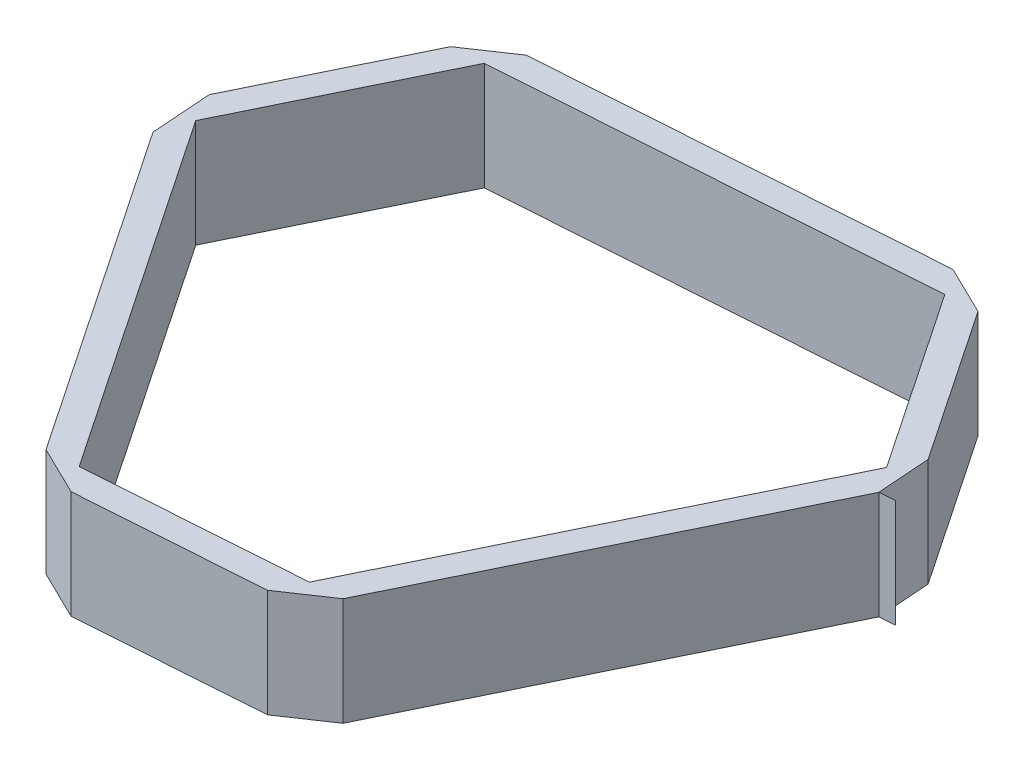
ISO-10303-21;
HEADER;
FILE_DESCRIPTION(('STEP AP214'),'2;1');
FILE_NAME('part.step','',(''),(''),'','','');
FILE_SCHEMA(('AUTOMOTIVE_DESIGN { 1 0 10303 214 1 1 1 1 }'));
ENDSEC;
DATA;
#1=APPLICATION_CONTEXT('core data for automotive mechanical design processes');
#2=APPLICATION_PROTOCOL_DEFINITION('international standard','automotive_design',2000,#1);
#3=PRODUCT_CONTEXT('',#1,'mechanical');
#4=PRODUCT('Part','Part','',(#3));
#5=PRODUCT_RELATED_PRODUCT_CATEGORY('part','',(#4));
#6=PRODUCT_DEFINITION_FORMATION('','',#4);
#7=PRODUCT_DEFINITION_CONTEXT('part definition',#1,'design');
#8=PRODUCT_DEFINITION('design','',#6,#7);
#9=PRODUCT_DEFINITION_SHAPE('','',#8);
#10=(LENGTH_UNIT() NAMED_UNIT(*) SI_UNIT(.MILLI.,.METRE.));
#11=(NAMED_UNIT(*) PLANE_ANGLE_UNIT() SI_UNIT($,.RADIAN.));
#12=(NAMED_UNIT(*) SI_UNIT($,.STERADIAN.) SOLID_ANGLE_UNIT());
#13=UNCERTAINTY_MEASURE_WITH_UNIT(LENGTH_MEASURE(1.E-05),#10,'distance_accuracy_value','');
#14=(GEOMETRIC_REPRESENTATION_CONTEXT(3) GLOBAL_UNCERTAINTY_ASSIGNED_CONTEXT((#13)) GLOBAL_UNIT_ASSIGNED_CONTEXT((#10,
#11,#12)) REPRESENTATION_CONTEXT('',''));
#15=CARTESIAN_POINT('',(0.,0.,0.));
#16=DIRECTION('',(0.,0.,1.));
#17=DIRECTION('',(1.,0.,0.));
#18=AXIS2_PLACEMENT_3D('',#15,#16,#17);
#19=CARTESIAN_POINT('',(0.,25.4,0.));
#20=DIRECTION('',(0.,1.,0.));
#21=DIRECTION('',(0.,0.,1.));
#22=AXIS2_PLACEMENT_3D('',#19,#20,#21);
#23=PLANE('',#22);
#24=DIRECTION('',(0.898726484276233,0.,0.438509642380281));
#25=VECTOR('',#24,1.);
#26=CARTESIAN_POINT('',(102.581317269426,25.4,-95.3013568397199));
#27=LINE('',#26,#25);
#28=CARTESIAN_POINT('',(91.0634324059276,25.4,-100.921201876931));
#29=VERTEX_POINT('',#28);
#30=CARTESIAN_POINT('',(102.581317269426,25.4,-95.3013568397199));
#31=VERTEX_POINT('',#30);
#32=EDGE_CURVE('E309',#29,#31,#27,.T.);
#33=ORIENTED_EDGE('',*,*,#32,.F.);
#34=DIRECTION('',(-0.997574787627234,0.,0.0696027520323615));
#35=VECTOR('',#34,1.);
#36=CARTESIAN_POINT('',(-10.2234799793334,25.4,-93.8542150862529));
#37=LINE('',#36,#35);
#38=CARTESIAN_POINT('',(-2.84222802506587,25.4,-94.3692195308653));
#39=VERTEX_POINT('',#38);
#40=EDGE_CURVE('E225',#29,#39,#37,.T.);
#41=ORIENTED_EDGE('',*,*,#40,.T.);
#42=DIRECTION('',(0.829123732243865,0.,-0.559065145246959));
#43=VECTOR('',#42,1.);
#44=CARTESIAN_POINT('',(-2.84222802506587,25.4,-94.3692195308653));
#45=LINE('',#44,#43);
#46=CARTESIAN_POINT('',(-13.4680990243711,25.4,-87.2043611598173));
#47=VERTEX_POINT('',#46);
#48=EDGE_CURVE('E64',#47,#39,#45,.T.);
#49=ORIENTED_EDGE('',*,*,#48,.F.);
#50=DIRECTION('',(-0.438509642380281,0.,0.898726484276233));
#51=VECTOR('',#50,1.);
#52=CARTESIAN_POINT('',(-35.7150752951471,25.4,-41.6091339691862));
#53=LINE('',#52,#51);
#54=CARTESIAN_POINT('',(-32.0892378011424,25.4,-49.0402959519775));
#55=VERTEX_POINT('',#54);
#56=EDGE_CURVE('E223',#47,#55,#53,.T.);
#57=ORIENTED_EDGE('',*,*,#56,.T.);
#58=DIRECTION('',(0.0696027520323643,0.,0.997574787627234));
#59=VECTOR('',#58,1.);
#60=CARTESIAN_POINT('',(-28.5287186204652,25.4,1.99050472462755));
#61=LINE('',#60,#59);
#62=CARTESIAN_POINT('',(-31.092418985415,25.4,-34.7534855979885));
#63=VERTEX_POINT('',#62);
#64=EDGE_CURVE('E293',#55,#63,#61,.T.);
#65=ORIENTED_EDGE('',*,*,#64,.T.);
#66=DIRECTION('',(0.559065145246955,0.,0.829123732243868));
#67=VECTOR('',#66,1.);
#68=CARTESIAN_POINT('',(25.1852038956499,25.4,48.7092613138225));
#69=LINE('',#68,#67);
#70=CARTESIAN_POINT('',(21.0485709864198,25.4,42.5744118319993));
#71=VERTEX_POINT('',#70);
#72=EDGE_CURVE('E221',#63,#71,#69,.T.);
#73=ORIENTED_EDGE('',*,*,#72,.T.);
#74=DIRECTION('',(-0.898726484276233,0.,-0.438509642380281));
#75=VECTOR('',#74,1.);
#76=CARTESIAN_POINT('',(32.5664558499177,25.4,48.1942568692102));
#77=LINE('',#76,#75);
#78=CARTESIAN_POINT('',(32.5664558499177,25.4,48.1942568692102));
#79=VERTEX_POINT('',#78);
#80=EDGE_CURVE('E179',#79,#71,#77,.T.);
#81=ORIENTED_EDGE('',*,*,#80,.F.);
#82=DIRECTION('',(0.997574787627234,0.,-0.0696027520323612));
#83=VECTOR('',#82,1.);
#84=CARTESIAN_POINT('',(83.1765690237152,25.4,44.6630898817764));
#85=LINE('',#84,#83);
#86=CARTESIAN_POINT('',(75.7953170694474,25.4,45.1780943263887));
#87=VERTEX_POINT('',#86);
#88=EDGE_CURVE('E217',#79,#87,#85,.T.);
#89=ORIENTED_EDGE('',*,*,#88,.T.);
#90=DIRECTION('',(-0.829123732243869,0.,0.559065145246953));
#91=VECTOR('',#90,1.);
#92=CARTESIAN_POINT('',(75.7953170694474,25.4,45.1780943263888));
#93=LINE('',#92,#91);
#94=CARTESIAN_POINT('',(86.4211880687529,25.4,38.0132359553407));
#95=VERTEX_POINT('',#94);
#96=EDGE_CURVE('E302',#95,#87,#93,.T.);
#97=ORIENTED_EDGE('',*,*,#96,.F.);
#98=DIRECTION('',(0.43850964238028,0.,-0.898726484276233));
#99=VECTOR('',#98,1.);
#100=CARTESIAN_POINT('',(83.1765690237152,25.4,44.6630898817764));
#101=LINE('',#100,#99);
#102=CARTESIAN_POINT('',(127.78747707898,25.4,-46.7670650841414));
#103=VERTEX_POINT('',#102);
#104=EDGE_CURVE('E220',#95,#103,#101,.T.);
#105=ORIENTED_EDGE('',*,*,#104,.T.);
#106=DIRECTION('',(0.0710028791074202,0.,0.997476110570302));
#107=VECTOR('',#106,1.);
#108=CARTESIAN_POINT('',(126.899940215872,25.4,-59.2355287482866));
#109=LINE('',#108,#107);
#110=CARTESIAN_POINT('',(126.899940215872,25.4,-59.2355287482866));
#111=VERTEX_POINT('',#110);
#112=EDGE_CURVE('E12',#111,#103,#109,.T.);
#113=ORIENTED_EDGE('',*,*,#112,.F.);
#114=DIRECTION('',(-0.559065145246958,0.,-0.829123732243866));
#115=VECTOR('',#114,1.);
#116=CARTESIAN_POINT('',(130.944454172447,25.4,-53.2372966365231));
#117=LINE('',#116,#115);
#118=EDGE_CURVE('E228',#111,#31,#117,.T.);
#119=ORIENTED_EDGE('',*,*,#118,.T.);
#120=EDGE_LOOP('',(#33,#41,#49,#57,#65,#73,#81,#89,#97,#105,#113,#119));
#121=FACE_BOUND('',#120,.T.);
#122=DIRECTION('',(-0.559065145246958,0.,-0.829123732243866));
#123=VECTOR('',#122,1.);
#124=CARTESIAN_POINT('',(123.629888255845,25.4,-52.7269450077209));
#125=LINE('',#124,#123);
#126=CARTESIAN_POINT('',(123.629888255845,25.4,-52.7269450077209));
#127=VERTEX_POINT('',#126);
#128=CARTESIAN_POINT('',(95.2293788773,25.4,-94.846430605709));
#129=VERTEX_POINT('',#128);
#130=EDGE_CURVE('E246',#127,#129,#125,.T.);
#131=ORIENTED_EDGE('',*,*,#130,.F.);
#132=DIRECTION('',(0.43850964238028,0.,-0.898726484276233));
#133=VECTOR('',#132,1.);
#134=CARTESIAN_POINT('',(79.0773085900088,25.4,38.5836657947445));
#135=LINE('',#134,#133);
#136=CARTESIAN_POINT('',(79.0773085900088,25.4,38.5836657947445));
#137=VERTEX_POINT('',#136);
#138=EDGE_CURVE('E243',#137,#127,#135,.T.);
#139=ORIENTED_EDGE('',*,*,#138,.F.);
#140=DIRECTION('',(0.997574787627234,0.,-0.0696027520323612));
#141=VECTOR('',#140,1.);
#142=CARTESIAN_POINT('',(79.0773085900088,25.4,38.5836657947445));
#143=LINE('',#142,#141);
#144=CARTESIAN_POINT('',(28.4005093785453,25.4,42.1194855979885));
#145=VERTEX_POINT('',#144);
#146=EDGE_CURVE('E240',#145,#137,#143,.T.);
#147=ORIENTED_EDGE('',*,*,#146,.F.);
#148=DIRECTION('',(0.559065145246955,0.,0.829123732243868));
#149=VECTOR('',#148,1.);
#150=CARTESIAN_POINT('',(28.4005093785453,25.4,42.1194855979885));
#151=LINE('',#150,#149);
#152=CARTESIAN_POINT('',(-28.4005093785453,25.4,-42.1194855979885));
#153=VERTEX_POINT('',#152);
#154=EDGE_CURVE('E237',#153,#145,#151,.T.);
#155=ORIENTED_EDGE('',*,*,#154,.F.);
#156=DIRECTION('',(-0.438509642380281,0.,0.898726484276233));
#157=VECTOR('',#156,1.);
#158=CARTESIAN_POINT('',(-28.4005093785453,25.4,-42.1194855979885));
#159=LINE('',#158,#157);
#160=CARTESIAN_POINT('',(-6.12421954562703,25.4,-87.7747909992211));
#161=VERTEX_POINT('',#160);
#162=EDGE_CURVE('E202',#161,#153,#159,.T.);
#163=ORIENTED_EDGE('',*,*,#162,.F.);
#164=DIRECTION('',(-0.997574787627234,0.,0.0696027520323615));
#165=VECTOR('',#164,1.);
#166=CARTESIAN_POINT('',(-6.12421954562703,25.4,-87.7747909992211));
#167=LINE('',#166,#165);
#168=EDGE_CURVE('E249',#129,#161,#167,.T.);
#169=ORIENTED_EDGE('',*,*,#168,.F.);
#170=EDGE_LOOP('',(#131,#139,#147,#155,#163,#169));
#171=FACE_BOUND('',#170,.T.);
#172=ADVANCED_FACE('F49',(#121,#171),#23,.T.);
#173=CARTESIAN_POINT('',(0.,0.,0.));
#174=DIRECTION('',(0.,1.,0.));
#175=DIRECTION('',(0.,0.,1.));
#176=AXIS2_PLACEMENT_3D('',#173,#174,#175);
#177=PLANE('',#176);
#178=DIRECTION('',(0.43850964238028,0.,-0.898726484276233));
#179=VECTOR('',#178,1.);
#180=CARTESIAN_POINT('',(79.0773085900088,0.,38.5836657947445));
#181=LINE('',#180,#179);
#182=CARTESIAN_POINT('',(79.0773085900088,0.,38.5836657947445));
#183=VERTEX_POINT('',#182);
#184=CARTESIAN_POINT('',(123.629888255845,0.,-52.7269450077209));
#185=VERTEX_POINT('',#184);
#186=EDGE_CURVE('E233',#183,#185,#181,.T.);
#187=ORIENTED_EDGE('',*,*,#186,.T.);
#188=DIRECTION('',(-0.559065145246958,0.,-0.829123732243866));
#189=VECTOR('',#188,1.);
#190=CARTESIAN_POINT('',(123.629888255845,0.,-52.7269450077209));
#191=LINE('',#190,#189);
#192=CARTESIAN_POINT('',(95.2293788773,0.,-94.846430605709));
#193=VERTEX_POINT('',#192);
#194=EDGE_CURVE('E257',#185,#193,#191,.T.);
#195=ORIENTED_EDGE('',*,*,#194,.T.);
#196=DIRECTION('',(-0.997574787627234,0.,0.0696027520323615));
#197=VECTOR('',#196,1.);
#198=CARTESIAN_POINT('',(-6.12421954562703,0.,-87.7747909992211));
#199=LINE('',#198,#197);
#200=CARTESIAN_POINT('',(-6.12421954562703,0.,-87.7747909992211));
#201=VERTEX_POINT('',#200);
#202=EDGE_CURVE('E253',#193,#201,#199,.T.);
#203=ORIENTED_EDGE('',*,*,#202,.T.);
#204=DIRECTION('',(-0.438509642380281,0.,0.898726484276233));
#205=VECTOR('',#204,1.);
#206=CARTESIAN_POINT('',(-28.4005093785453,0.,-42.1194855979885));
#207=LINE('',#206,#205);
#208=CARTESIAN_POINT('',(-28.4005093785453,0.,-42.1194855979885));
#209=VERTEX_POINT('',#208);
#210=EDGE_CURVE('E256',#201,#209,#207,.T.);
#211=ORIENTED_EDGE('',*,*,#210,.T.);
#212=DIRECTION('',(0.559065145246955,0.,0.829123732243868));
#213=VECTOR('',#212,1.);
#214=CARTESIAN_POINT('',(28.4005093785453,0.,42.1194855979885));
#215=LINE('',#214,#213);
#216=CARTESIAN_POINT('',(28.4005093785453,0.,42.1194855979885));
#217=VERTEX_POINT('',#216);
#218=EDGE_CURVE('E264',#209,#217,#215,.T.);
#219=ORIENTED_EDGE('',*,*,#218,.T.);
#220=DIRECTION('',(0.997574787627234,0.,-0.0696027520323612));
#221=VECTOR('',#220,1.);
#222=CARTESIAN_POINT('',(79.0773085900088,0.,38.5836657947445));
#223=LINE('',#222,#221);
#224=EDGE_CURVE('E216',#217,#183,#223,.T.);
#225=ORIENTED_EDGE('',*,*,#224,.T.);
#226=EDGE_LOOP('',(#187,#195,#203,#211,#219,#225));
#227=FACE_BOUND('',#226,.T.);
#228=DIRECTION('',(-0.997574787627234,0.,0.0696027520323615));
#229=VECTOR('',#228,1.);
#230=CARTESIAN_POINT('',(-10.2234799793334,0.,-93.8542150862529));
#231=LINE('',#230,#229);
#232=CARTESIAN_POINT('',(91.0634324059276,0.,-100.921201876931));
#233=VERTEX_POINT('',#232);
#234=CARTESIAN_POINT('',(-2.84222802506587,0.,-94.3692195308653));
#235=VERTEX_POINT('',#234);
#236=EDGE_CURVE('E204',#233,#235,#231,.T.);
#237=ORIENTED_EDGE('',*,*,#236,.F.);
#238=DIRECTION('',(-0.898726484276233,0.,-0.438509642380281));
#239=VECTOR('',#238,1.);
#240=CARTESIAN_POINT('',(102.581317269426,0.,-95.3013568397199));
#241=LINE('',#240,#239);
#242=CARTESIAN_POINT('',(102.581317269426,0.,-95.3013568397199));
#243=VERTEX_POINT('',#242);
#244=EDGE_CURVE('E72',#243,#233,#241,.T.);
#245=ORIENTED_EDGE('',*,*,#244,.F.);
#246=DIRECTION('',(-0.559065145246958,0.,-0.829123732243866));
#247=VECTOR('',#246,1.);
#248=CARTESIAN_POINT('',(130.944454172447,0.,-53.2372966365231));
#249=LINE('',#248,#247);
#250=CARTESIAN_POINT('',(126.899940215872,0.,-59.2355287482866));
#251=VERTEX_POINT('',#250);
#252=EDGE_CURVE('E210',#251,#243,#249,.T.);
#253=ORIENTED_EDGE('',*,*,#252,.F.);
#254=DIRECTION('',(-0.0710028791074202,0.,-0.997476110570302));
#255=VECTOR('',#254,1.);
#256=CARTESIAN_POINT('',(126.899940215872,0.,-59.2355287482866));
#257=LINE('',#256,#255);
#258=CARTESIAN_POINT('',(127.78747707898,0.,-46.7670650841414));
#259=VERTEX_POINT('',#258);
#260=EDGE_CURVE('E57',#259,#251,#257,.T.);
#261=ORIENTED_EDGE('',*,*,#260,.F.);
#262=DIRECTION('',(0.43850964238028,0.,-0.898726484276233));
#263=VECTOR('',#262,1.);
#264=CARTESIAN_POINT('',(83.1765690237152,0.,44.6630898817764));
#265=LINE('',#264,#263);
#266=CARTESIAN_POINT('',(86.4211880687529,0.,38.0132359553407));
#267=VERTEX_POINT('',#266);
#268=EDGE_CURVE('E214',#267,#259,#265,.T.);
#269=ORIENTED_EDGE('',*,*,#268,.F.);
#270=DIRECTION('',(0.829123732243869,0.,-0.559065145246953));
#271=VECTOR('',#270,1.);
#272=CARTESIAN_POINT('',(75.7953170694474,0.,45.1780943263888));
#273=LINE('',#272,#271);
#274=CARTESIAN_POINT('',(75.7953170694474,0.,45.1780943263888));
#275=VERTEX_POINT('',#274);
#276=EDGE_CURVE('E297',#275,#267,#273,.T.);
#277=ORIENTED_EDGE('',*,*,#276,.F.);
#278=DIRECTION('',(0.997574787627234,0.,-0.0696027520323612));
#279=VECTOR('',#278,1.);
#280=CARTESIAN_POINT('',(83.1765690237152,0.,44.6630898817764));
#281=LINE('',#280,#279);
#282=CARTESIAN_POINT('',(32.5664558499177,0.,48.1942568692102));
#283=VERTEX_POINT('',#282);
#284=EDGE_CURVE('E195',#283,#275,#281,.T.);
#285=ORIENTED_EDGE('',*,*,#284,.F.);
#286=DIRECTION('',(0.898726484276233,0.,0.438509642380281));
#287=VECTOR('',#286,1.);
#288=CARTESIAN_POINT('',(32.5664558499177,0.,48.1942568692102));
#289=LINE('',#288,#287);
#290=CARTESIAN_POINT('',(21.0485709864198,0.,42.5744118319993));
#291=VERTEX_POINT('',#290);
#292=EDGE_CURVE('E176',#291,#283,#289,.T.);
#293=ORIENTED_EDGE('',*,*,#292,.F.);
#294=DIRECTION('',(0.559065145246955,0.,0.829123732243868));
#295=VECTOR('',#294,1.);
#296=CARTESIAN_POINT('',(25.1852038956499,0.,48.7092613138225));
#297=LINE('',#296,#295);
#298=CARTESIAN_POINT('',(-31.092418985415,0.,-34.7534855979885));
#299=VERTEX_POINT('',#298);
#300=EDGE_CURVE('E192',#299,#291,#297,.T.);
#301=ORIENTED_EDGE('',*,*,#300,.F.);
#302=DIRECTION('',(-0.0696027520323643,0.,-0.997574787627234));
#303=VECTOR('',#302,1.);
#304=CARTESIAN_POINT('',(-28.5287186204652,0.,1.99050472462755));
#305=LINE('',#304,#303);
#306=CARTESIAN_POINT('',(-32.0892378011424,0.,-49.0402959519775));
#307=VERTEX_POINT('',#306);
#308=EDGE_CURVE('E231',#299,#307,#305,.T.);
#309=ORIENTED_EDGE('',*,*,#308,.T.);
#310=DIRECTION('',(-0.438509642380281,0.,0.898726484276233));
#311=VECTOR('',#310,1.);
#312=CARTESIAN_POINT('',(-35.7150752951471,0.,-41.6091339691862));
#313=LINE('',#312,#311);
#314=CARTESIAN_POINT('',(-13.4680990243711,0.,-87.2043611598173));
#315=VERTEX_POINT('',#314);
#316=EDGE_CURVE('E200',#315,#307,#313,.T.);
#317=ORIENTED_EDGE('',*,*,#316,.F.);
#318=DIRECTION('',(-0.829123732243865,0.,0.559065145246959));
#319=VECTOR('',#318,1.);
#320=CARTESIAN_POINT('',(-2.84222802506587,0.,-94.3692195308653));
#321=LINE('',#320,#319);
#322=EDGE_CURVE('E311',#235,#315,#321,.T.);
#323=ORIENTED_EDGE('',*,*,#322,.F.);
#324=EDGE_LOOP('',(#237,#245,#253,#261,#269,#277,#285,#293,#301,#309,#317,#323));
#325=FACE_BOUND('',#324,.T.);
#326=ADVANCED_FACE('F190',(#227,#325),#177,.F.);
#327=CARTESIAN_POINT('',(-35.7150752951471,25.4,-41.6091339691862));
#328=DIRECTION('',(0.898726484276233,0.,0.438509642380281));
#329=DIRECTION('',(0.438509642380281,0.,-0.898726484276233));
#330=AXIS2_PLACEMENT_3D('',#327,#328,#329);
#331=PLANE('',#330);
#332=ORIENTED_EDGE('',*,*,#56,.F.);
#333=DIRECTION('',(0.,1.,0.));
#334=VECTOR('',#333,1.);
#335=CARTESIAN_POINT('',(-13.4680990243711,-13.0498294967183,-87.2043611598173));
#336=LINE('',#335,#334);
#337=EDGE_CURVE('E316',#315,#47,#336,.T.);
#338=ORIENTED_EDGE('',*,*,#337,.F.);
#339=ORIENTED_EDGE('',*,*,#316,.T.);
#340=DIRECTION('',(0.,1.,0.));
#341=VECTOR('',#340,1.);
#342=CARTESIAN_POINT('',(-32.0892378011424,-15.0160547897493,-49.0402959519775));
#343=LINE('',#342,#341);
#344=EDGE_CURVE('E290',#307,#55,#343,.T.);
#345=ORIENTED_EDGE('',*,*,#344,.T.);
#346=EDGE_LOOP('',(#332,#338,#339,#345));
#347=FACE_BOUND('',#346,.T.);
#348=ADVANCED_FACE('F345',(#347),#331,.F.);
#349=CARTESIAN_POINT('',(25.1852038956499,25.4,48.7092613138225));
#350=DIRECTION('',(0.829123732243868,0.,-0.559065145246955));
#351=DIRECTION('',(-0.559065145246955,0.,-0.829123732243868));
#352=AXIS2_PLACEMENT_3D('',#349,#350,#351);
#353=PLANE('',#352);
#354=ORIENTED_EDGE('',*,*,#300,.T.);
#355=DIRECTION('',(0.,1.,0.));
#356=VECTOR('',#355,1.);
#357=CARTESIAN_POINT('',(21.0485709864198,-13.0498294967183,42.5744118319993));
#358=LINE('',#357,#356);
#359=EDGE_CURVE('E173',#291,#71,#358,.T.);
#360=ORIENTED_EDGE('',*,*,#359,.T.);
#361=ORIENTED_EDGE('',*,*,#72,.F.);
#362=DIRECTION('',(0.,1.,0.));
#363=VECTOR('',#362,1.);
#364=CARTESIAN_POINT('',(-31.092418985415,-15.0160547897493,-34.7534855979885));
#365=LINE('',#364,#363);
#366=EDGE_CURVE('E199',#299,#63,#365,.T.);
#367=ORIENTED_EDGE('',*,*,#366,.F.);
#368=EDGE_LOOP('',(#354,#360,#361,#367));
#369=FACE_BOUND('',#368,.T.);
#370=ADVANCED_FACE('F198',(#369),#353,.F.);
#371=CARTESIAN_POINT('',(83.1765690237152,25.4,44.6630898817764));
#372=DIRECTION('',(-0.898726484276233,0.,-0.43850964238028));
#373=DIRECTION('',(-0.43850964238028,0.,0.898726484276233));
#374=AXIS2_PLACEMENT_3D('',#371,#372,#373);
#375=PLANE('',#374);
#376=ORIENTED_EDGE('',*,*,#104,.F.);
#377=DIRECTION('',(0.,1.,0.));
#378=VECTOR('',#377,1.);
#379=CARTESIAN_POINT('',(86.4211880687529,-13.0498294967183,38.0132359553407));
#380=LINE('',#379,#378);
#381=EDGE_CURVE('E299',#267,#95,#380,.T.);
#382=ORIENTED_EDGE('',*,*,#381,.F.);
#383=ORIENTED_EDGE('',*,*,#268,.T.);
#384=DIRECTION('',(0.,1.,0.));
#385=VECTOR('',#384,1.);
#386=CARTESIAN_POINT('',(127.78747707898,25.4,-46.7670650841414));
#387=LINE('',#386,#385);
#388=EDGE_CURVE('E52',#259,#103,#387,.T.);
#389=ORIENTED_EDGE('',*,*,#388,.T.);
#390=EDGE_LOOP('',(#376,#382,#383,#389));
#391=FACE_BOUND('',#390,.T.);
#392=ADVANCED_FACE('F334',(#391),#375,.F.);
#393=CARTESIAN_POINT('',(130.944454172447,25.4,-53.2372966365231));
#394=DIRECTION('',(-0.829123732243866,0.,0.559065145246958));
#395=DIRECTION('',(0.559065145246958,0.,0.829123732243866));
#396=AXIS2_PLACEMENT_3D('',#393,#394,#395);
#397=PLANE('',#396);
#398=ORIENTED_EDGE('',*,*,#252,.T.);
#399=DIRECTION('',(0.,1.,0.));
#400=VECTOR('',#399,1.);
#401=CARTESIAN_POINT('',(102.581317269426,-13.0498294967183,-95.3013568397199));
#402=LINE('',#401,#400);
#403=EDGE_CURVE('E312',#243,#31,#402,.T.);
#404=ORIENTED_EDGE('',*,*,#403,.T.);
#405=ORIENTED_EDGE('',*,*,#118,.F.);
#406=DIRECTION('',(0.,-1.,0.));
#407=VECTOR('',#406,1.);
#408=CARTESIAN_POINT('',(126.899940215872,25.4,-59.2355287482866));
#409=LINE('',#408,#407);
#410=EDGE_CURVE('E213',#111,#251,#409,.T.);
#411=ORIENTED_EDGE('',*,*,#410,.T.);
#412=EDGE_LOOP('',(#398,#404,#405,#411));
#413=FACE_BOUND('',#412,.T.);
#414=ADVANCED_FACE('F288',(#413),#397,.F.);
#415=CARTESIAN_POINT('',(-10.2234799793334,25.4,-93.8542150862529));
#416=DIRECTION('',(0.0696027520323615,0.,0.997574787627234));
#417=DIRECTION('',(0.997574787627234,0.,-0.0696027520323615));
#418=AXIS2_PLACEMENT_3D('',#415,#416,#417);
#419=PLANE('',#418);
#420=ORIENTED_EDGE('',*,*,#40,.F.);
#421=DIRECTION('',(0.,1.,0.));
#422=VECTOR('',#421,1.);
#423=CARTESIAN_POINT('',(91.0634324059276,-13.0498294967183,-100.921201876931));
#424=LINE('',#423,#422);
#425=EDGE_CURVE('E308',#233,#29,#424,.T.);
#426=ORIENTED_EDGE('',*,*,#425,.F.);
#427=ORIENTED_EDGE('',*,*,#236,.T.);
#428=DIRECTION('',(0.,1.,0.));
#429=VECTOR('',#428,1.);
#430=CARTESIAN_POINT('',(-2.84222802506587,-13.0498294967183,-94.3692195308653));
#431=LINE('',#430,#429);
#432=EDGE_CURVE('E317',#235,#39,#431,.T.);
#433=ORIENTED_EDGE('',*,*,#432,.T.);
#434=EDGE_LOOP('',(#420,#426,#427,#433));
#435=FACE_BOUND('',#434,.T.);
#436=ADVANCED_FACE('F337',(#435),#419,.F.);
#437=CARTESIAN_POINT('',(83.1765690237152,25.4,44.6630898817764));
#438=DIRECTION('',(-0.0696027520323612,0.,-0.997574787627234));
#439=DIRECTION('',(-0.997574787627235,0.,0.0696027520323612));
#440=AXIS2_PLACEMENT_3D('',#437,#438,#439);
#441=PLANE('',#440);
#442=ORIENTED_EDGE('',*,*,#88,.F.);
#443=DIRECTION('',(0.,1.,0.));
#444=VECTOR('',#443,1.);
#445=CARTESIAN_POINT('',(32.5664558499177,-13.0498294967183,48.1942568692102));
#446=LINE('',#445,#444);
#447=EDGE_CURVE('E184',#283,#79,#446,.T.);
#448=ORIENTED_EDGE('',*,*,#447,.F.);
#449=ORIENTED_EDGE('',*,*,#284,.T.);
#450=DIRECTION('',(0.,1.,0.));
#451=VECTOR('',#450,1.);
#452=CARTESIAN_POINT('',(75.7953170694474,-13.0498294967183,45.1780943263888));
#453=LINE('',#452,#451);
#454=EDGE_CURVE('E301',#275,#87,#453,.T.);
#455=ORIENTED_EDGE('',*,*,#454,.T.);
#456=EDGE_LOOP('',(#442,#448,#449,#455));
#457=FACE_BOUND('',#456,.T.);
#458=ADVANCED_FACE('F328',(#457),#441,.F.);
#459=CARTESIAN_POINT('',(-28.4005093785453,25.4,-42.1194855979885));
#460=DIRECTION('',(0.898726484276233,0.,0.438509642380281));
#461=DIRECTION('',(0.438509642380281,0.,-0.898726484276233));
#462=AXIS2_PLACEMENT_3D('',#459,#460,#461);
#463=PLANE('',#462);
#464=ORIENTED_EDGE('',*,*,#210,.F.);
#465=DIRECTION('',(0.,-1.,0.));
#466=VECTOR('',#465,1.);
#467=CARTESIAN_POINT('',(-6.12421954562703,25.4,-87.7747909992211));
#468=LINE('',#467,#466);
#469=EDGE_CURVE('E250',#161,#201,#468,.T.);
#470=ORIENTED_EDGE('',*,*,#469,.F.);
#471=ORIENTED_EDGE('',*,*,#162,.T.);
#472=DIRECTION('',(0.,-1.,0.));
#473=VECTOR('',#472,1.);
#474=CARTESIAN_POINT('',(-28.4005093785453,25.4,-42.1194855979885));
#475=LINE('',#474,#473);
#476=EDGE_CURVE('E234',#153,#209,#475,.T.);
#477=ORIENTED_EDGE('',*,*,#476,.T.);
#478=EDGE_LOOP('',(#464,#470,#471,#477));
#479=FACE_BOUND('',#478,.T.);
#480=ADVANCED_FACE('F387',(#479),#463,.T.);
#481=CARTESIAN_POINT('',(28.4005093785453,25.4,42.1194855979885));
#482=DIRECTION('',(0.829123732243868,0.,-0.559065145246955));
#483=DIRECTION('',(-0.559065145246955,0.,-0.829123732243868));
#484=AXIS2_PLACEMENT_3D('',#481,#482,#483);
#485=PLANE('',#484);
#486=ORIENTED_EDGE('',*,*,#218,.F.);
#487=ORIENTED_EDGE('',*,*,#476,.F.);
#488=ORIENTED_EDGE('',*,*,#154,.T.);
#489=DIRECTION('',(0.,-1.,0.));
#490=VECTOR('',#489,1.);
#491=CARTESIAN_POINT('',(28.4005093785453,25.4,42.1194855979885));
#492=LINE('',#491,#490);
#493=EDGE_CURVE('E238',#145,#217,#492,.T.);
#494=ORIENTED_EDGE('',*,*,#493,.T.);
#495=EDGE_LOOP('',(#486,#487,#488,#494));
#496=FACE_BOUND('',#495,.T.);
#497=ADVANCED_FACE('F383',(#496),#485,.T.);
#498=CARTESIAN_POINT('',(79.0773085900088,25.4,38.5836657947445));
#499=DIRECTION('',(-0.0696027520323612,0.,-0.997574787627234));
#500=DIRECTION('',(-0.997574787627235,0.,0.0696027520323612));
#501=AXIS2_PLACEMENT_3D('',#498,#499,#500);
#502=PLANE('',#501);
#503=ORIENTED_EDGE('',*,*,#224,.F.);
#504=ORIENTED_EDGE('',*,*,#493,.F.);
#505=ORIENTED_EDGE('',*,*,#146,.T.);
#506=DIRECTION('',(0.,-1.,0.));
#507=VECTOR('',#506,1.);
#508=CARTESIAN_POINT('',(79.0773085900088,25.4,38.5836657947445));
#509=LINE('',#508,#507);
#510=EDGE_CURVE('E241',#137,#183,#509,.T.);
#511=ORIENTED_EDGE('',*,*,#510,.T.);
#512=EDGE_LOOP('',(#503,#504,#505,#511));
#513=FACE_BOUND('',#512,.T.);
#514=ADVANCED_FACE('F379',(#513),#502,.T.);
#515=CARTESIAN_POINT('',(79.0773085900088,25.4,38.5836657947445));
#516=DIRECTION('',(-0.898726484276233,0.,-0.43850964238028));
#517=DIRECTION('',(-0.43850964238028,0.,0.898726484276233));
#518=AXIS2_PLACEMENT_3D('',#515,#516,#517);
#519=PLANE('',#518);
#520=ORIENTED_EDGE('',*,*,#186,.F.);
#521=ORIENTED_EDGE('',*,*,#510,.F.);
#522=ORIENTED_EDGE('',*,*,#138,.T.);
#523=DIRECTION('',(0.,-1.,0.));
#524=VECTOR('',#523,1.);
#525=CARTESIAN_POINT('',(123.629888255845,25.4,-52.7269450077209));
#526=LINE('',#525,#524);
#527=EDGE_CURVE('E244',#127,#185,#526,.T.);
#528=ORIENTED_EDGE('',*,*,#527,.T.);
#529=EDGE_LOOP('',(#520,#521,#522,#528));
#530=FACE_BOUND('',#529,.T.);
#531=ADVANCED_FACE('F375',(#530),#519,.T.);
#532=CARTESIAN_POINT('',(123.629888255845,25.4,-52.7269450077209));
#533=DIRECTION('',(-0.829123732243866,0.,0.559065145246958));
#534=DIRECTION('',(0.559065145246958,0.,0.829123732243866));
#535=AXIS2_PLACEMENT_3D('',#532,#533,#534);
#536=PLANE('',#535);
#537=ORIENTED_EDGE('',*,*,#194,.F.);
#538=ORIENTED_EDGE('',*,*,#527,.F.);
#539=ORIENTED_EDGE('',*,*,#130,.T.);
#540=DIRECTION('',(0.,-1.,0.));
#541=VECTOR('',#540,1.);
#542=CARTESIAN_POINT('',(95.2293788773,25.4,-94.846430605709));
#543=LINE('',#542,#541);
#544=EDGE_CURVE('E247',#129,#193,#543,.T.);
#545=ORIENTED_EDGE('',*,*,#544,.T.);
#546=EDGE_LOOP('',(#537,#538,#539,#545));
#547=FACE_BOUND('',#546,.T.);
#548=ADVANCED_FACE('F371',(#547),#536,.T.);
#549=CARTESIAN_POINT('',(-6.12421954562703,25.4,-87.7747909992211));
#550=DIRECTION('',(0.0696027520323615,0.,0.997574787627234));
#551=DIRECTION('',(0.997574787627234,0.,-0.0696027520323615));
#552=AXIS2_PLACEMENT_3D('',#549,#550,#551);
#553=PLANE('',#552);
#554=ORIENTED_EDGE('',*,*,#202,.F.);
#555=ORIENTED_EDGE('',*,*,#544,.F.);
#556=ORIENTED_EDGE('',*,*,#168,.T.);
#557=ORIENTED_EDGE('',*,*,#469,.T.);
#558=EDGE_LOOP('',(#554,#555,#556,#557));
#559=FACE_BOUND('',#558,.T.);
#560=ADVANCED_FACE('F357',(#559),#553,.T.);
#561=CARTESIAN_POINT('',(126.899940215872,-18.234167069748,-59.2355287482866));
#562=DIRECTION('',(-0.997476110570302,0.,0.0710028791074202));
#563=DIRECTION('',(0.0710028791074202,0.,0.997476110570302));
#564=AXIS2_PLACEMENT_3D('',#561,#562,#563);
#565=PLANE('',#564);
#566=ORIENTED_EDGE('',*,*,#260,.T.);
#567=ORIENTED_EDGE('',*,*,#410,.F.);
#568=ORIENTED_EDGE('',*,*,#112,.T.);
#569=ORIENTED_EDGE('',*,*,#388,.F.);
#570=EDGE_LOOP('',(#566,#567,#568,#569));
#571=FACE_BOUND('',#570,.T.);
#572=ADVANCED_FACE('F280',(#571),#565,.F.);
#573=CARTESIAN_POINT('',(-28.5287186204652,-15.0160547897493,1.99050472462755));
#574=DIRECTION('',(-0.997574787627234,0.,0.0696027520323643));
#575=DIRECTION('',(0.0696027520323643,0.,0.997574787627234));
#576=AXIS2_PLACEMENT_3D('',#573,#574,#575);
#577=PLANE('',#576);
#578=ORIENTED_EDGE('',*,*,#366,.T.);
#579=ORIENTED_EDGE('',*,*,#64,.F.);
#580=ORIENTED_EDGE('',*,*,#344,.F.);
#581=ORIENTED_EDGE('',*,*,#308,.F.);
#582=EDGE_LOOP('',(#578,#579,#580,#581));
#583=FACE_BOUND('',#582,.T.);
#584=ADVANCED_FACE('F348',(#583),#577,.T.);
#585=CARTESIAN_POINT('',(75.7953170694474,-13.0498294967183,45.1780943263888));
#586=DIRECTION('',(-0.559065145246953,0.,-0.829123732243869));
#587=DIRECTION('',(-0.829123732243869,0.,0.559065145246953));
#588=AXIS2_PLACEMENT_3D('',#585,#586,#587);
#589=PLANE('',#588);
#590=ORIENTED_EDGE('',*,*,#276,.T.);
#591=ORIENTED_EDGE('',*,*,#381,.T.);
#592=ORIENTED_EDGE('',*,*,#96,.T.);
#593=ORIENTED_EDGE('',*,*,#454,.F.);
#594=EDGE_LOOP('',(#590,#591,#592,#593));
#595=FACE_BOUND('',#594,.T.);
#596=ADVANCED_FACE('F330',(#595),#589,.F.);
#597=CARTESIAN_POINT('',(32.5664558499177,-13.0498294967183,48.1942568692102));
#598=DIRECTION('',(0.438509642380281,0.,-0.898726484276233));
#599=DIRECTION('',(-0.898726484276233,0.,-0.438509642380281));
#600=AXIS2_PLACEMENT_3D('',#597,#598,#599);
#601=PLANE('',#600);
#602=ORIENTED_EDGE('',*,*,#292,.T.);
#603=ORIENTED_EDGE('',*,*,#447,.T.);
#604=ORIENTED_EDGE('',*,*,#80,.T.);
#605=ORIENTED_EDGE('',*,*,#359,.F.);
#606=EDGE_LOOP('',(#602,#603,#604,#605));
#607=FACE_BOUND('',#606,.T.);
#608=ADVANCED_FACE('F175',(#607),#601,.F.);
#609=CARTESIAN_POINT('',(-2.84222802506587,-13.0498294967183,-94.3692195308653));
#610=DIRECTION('',(0.559065145246959,0.,0.829123732243865));
#611=DIRECTION('',(0.829123732243865,0.,-0.559065145246959));
#612=AXIS2_PLACEMENT_3D('',#609,#610,#611);
#613=PLANE('',#612);
#614=ORIENTED_EDGE('',*,*,#322,.T.);
#615=ORIENTED_EDGE('',*,*,#337,.T.);
#616=ORIENTED_EDGE('',*,*,#48,.T.);
#617=ORIENTED_EDGE('',*,*,#432,.F.);
#618=EDGE_LOOP('',(#614,#615,#616,#617));
#619=FACE_BOUND('',#618,.T.);
#620=ADVANCED_FACE('F339',(#619),#613,.F.);
#621=CARTESIAN_POINT('',(102.581317269426,-13.0498294967183,-95.3013568397199));
#622=DIRECTION('',(-0.438509642380281,0.,0.898726484276233));
#623=DIRECTION('',(0.898726484276233,0.,0.438509642380281));
#624=AXIS2_PLACEMENT_3D('',#621,#622,#623);
#625=PLANE('',#624);
#626=ORIENTED_EDGE('',*,*,#244,.T.);
#627=ORIENTED_EDGE('',*,*,#425,.T.);
#628=ORIENTED_EDGE('',*,*,#32,.T.);
#629=ORIENTED_EDGE('',*,*,#403,.F.);
#630=EDGE_LOOP('',(#626,#627,#628,#629));
#631=FACE_BOUND('',#630,.T.);
#632=ADVANCED_FACE('F439',(#631),#625,.F.);
#633=CLOSED_SHELL('',(#172,#326,#348,#370,#392,#414,#436,#458,#480,#497,#514,#531,#548,#560,
#572,#584,#596,#608,#620,#632));
#634=MANIFOLD_SOLID_BREP('B2',#633);
#635=CARTESIAN_POINT('',(130.541949367367,-15.3649106732676,-59.4896388791913));
#636=DIRECTION('',(0.997574787627234,0.,-0.0696027520323694));
#637=DIRECTION('',(-0.0696027520323694,0.,-0.997574787627234));
#638=AXIS2_PLACEMENT_3D('',#635,#636,#637);
#639=PLANE('',#638);
#640=DIRECTION('',(0.,-1.,0.));
#641=VECTOR('',#640,1.);
#642=CARTESIAN_POINT('',(131.411628812578,-15.3649106732676,-47.0250413952337));
#643=LINE('',#642,#641);
#644=CARTESIAN_POINT('',(131.411628812578,25.4,-47.0250413952337));
#645=VERTEX_POINT('',#644);
#646=CARTESIAN_POINT('',(131.411628812578,0.,-47.0250413952337));
#647=VERTEX_POINT('',#646);
#648=EDGE_CURVE('E548',#645,#647,#643,.T.);
#649=ORIENTED_EDGE('',*,*,#648,.F.);
#650=DIRECTION('',(-0.0696027520323694,0.,-0.997574787627234));
#651=VECTOR('',#650,1.);
#652=CARTESIAN_POINT('',(130.541949367367,25.4,-59.4896388791913));
#653=LINE('',#652,#651);
#654=CARTESIAN_POINT('',(131.411983767772,25.4,-47.0199540338509));
#655=VERTEX_POINT('',#654);
#656=EDGE_CURVE('E591',#655,#645,#653,.T.);
#657=ORIENTED_EDGE('',*,*,#656,.F.);
#658=DIRECTION('',(0.,1.,0.));
#659=VECTOR('',#658,1.);
#660=CARTESIAN_POINT('',(131.411983767772,-15.3649106732676,-47.0199540338509));
#661=LINE('',#660,#659);
#662=CARTESIAN_POINT('',(131.411983767772,0.,-47.0199540338509));
#663=VERTEX_POINT('',#662);
#664=EDGE_CURVE('E588',#663,#655,#661,.T.);
#665=ORIENTED_EDGE('',*,*,#664,.F.);
#666=DIRECTION('',(0.0696027520323694,0.,0.997574787627234));
#667=VECTOR('',#666,1.);
#668=CARTESIAN_POINT('',(130.541949367367,0.,-59.4896388791913));
#669=LINE('',#668,#667);
#670=EDGE_CURVE('E587',#647,#663,#669,.T.);
#671=ORIENTED_EDGE('',*,*,#670,.F.);
#672=EDGE_LOOP('',(#649,#657,#665,#671));
#673=FACE_BOUND('',#672,.T.);
#674=ADVANCED_FACE('F544',(#673),#639,.T.);
#675=CARTESIAN_POINT('',(131.411983767772,-15.3649106732676,-47.0199540338509));
#676=DIRECTION('',(0.069602752032367,0.,0.997574787627234));
#677=DIRECTION('',(0.997574787627234,0.,-0.069602752032367));
#678=AXIS2_PLACEMENT_3D('',#675,#676,#677);
#679=PLANE('',#678);
#680=DIRECTION('',(0.,1.,0.));
#681=VECTOR('',#680,1.);
#682=CARTESIAN_POINT('',(127.78747707898,25.4,-46.7670650841414));
#683=LINE('',#682,#681);
#684=CARTESIAN_POINT('',(127.78747707898,0.,-46.7670650841414));
#685=VERTEX_POINT('',#684);
#686=CARTESIAN_POINT('',(127.78747707898,25.4,-46.7670650841414));
#687=VERTEX_POINT('',#686);
#688=EDGE_CURVE('E47',#685,#687,#683,.T.);
#689=ORIENTED_EDGE('',*,*,#688,.F.);
#690=DIRECTION('',(-0.997574787627234,0.,0.069602752032367));
#691=VECTOR('',#690,1.);
#692=CARTESIAN_POINT('',(131.411983767772,0.,-47.0199540338509));
#693=LINE('',#692,#691);
#694=EDGE_CURVE('E585',#663,#685,#693,.T.);
#695=ORIENTED_EDGE('',*,*,#694,.F.);
#696=ORIENTED_EDGE('',*,*,#664,.T.);
#697=DIRECTION('',(0.997574787627234,0.,-0.069602752032367));
#698=VECTOR('',#697,1.);
#699=CARTESIAN_POINT('',(131.411983767772,25.4,-47.0199540338509));
#700=LINE('',#699,#698);
#701=EDGE_CURVE('E579',#687,#655,#700,.T.);
#702=ORIENTED_EDGE('',*,*,#701,.F.);
#703=EDGE_LOOP('',(#689,#695,#696,#702));
#704=FACE_BOUND('',#703,.T.);
#705=ADVANCED_FACE('F583',(#704),#679,.T.);
#706=CARTESIAN_POINT('',(0.,0.,0.));
#707=DIRECTION('',(0.,1.,0.));
#708=DIRECTION('',(0.,0.,1.));
#709=AXIS2_PLACEMENT_3D('',#706,#707,#708);
#710=PLANE('',#709);
#711=ORIENTED_EDGE('',*,*,#694,.T.);
#712=DIRECTION('',(-0.997476110570302,0.,0.0710028791074204));
#713=VECTOR('',#712,1.);
#714=CARTESIAN_POINT('',(127.78747707898,0.,-46.7670650841414));
#715=LINE('',#714,#713);
#716=EDGE_CURVE('E574',#647,#685,#715,.T.);
#717=ORIENTED_EDGE('',*,*,#716,.F.);
#718=ORIENTED_EDGE('',*,*,#670,.T.);
#719=EDGE_LOOP('',(#711,#717,#718));
#720=FACE_BOUND('',#719,.T.);
#721=ADVANCED_FACE('F546',(#720),#710,.F.);
#722=CARTESIAN_POINT('',(0.,25.4,0.));
#723=DIRECTION('',(0.,1.,0.));
#724=DIRECTION('',(0.,0.,1.));
#725=AXIS2_PLACEMENT_3D('',#722,#723,#724);
#726=PLANE('',#725);
#727=DIRECTION('',(0.997476110570302,0.,-0.0710028791074204));
#728=VECTOR('',#727,1.);
#729=CARTESIAN_POINT('',(127.78747707898,25.4,-46.7670650841414));
#730=LINE('',#729,#728);
#731=EDGE_CURVE('E562',#687,#645,#730,.T.);
#732=ORIENTED_EDGE('',*,*,#731,.F.);
#733=ORIENTED_EDGE('',*,*,#701,.T.);
#734=ORIENTED_EDGE('',*,*,#656,.T.);
#735=EDGE_LOOP('',(#732,#733,#734));
#736=FACE_BOUND('',#735,.T.);
#737=ADVANCED_FACE('F599',(#736),#726,.T.);
#738=CARTESIAN_POINT('',(127.78747707898,-18.234167069748,-46.7670650841414));
#739=DIRECTION('',(0.0710028791074204,0.,0.997476110570302));
#740=DIRECTION('',(0.997476110570302,0.,-0.0710028791074204));
#741=AXIS2_PLACEMENT_3D('',#738,#739,#740);
#742=PLANE('',#741);
#743=ORIENTED_EDGE('',*,*,#648,.T.);
#744=ORIENTED_EDGE('',*,*,#716,.T.);
#745=ORIENTED_EDGE('',*,*,#688,.T.);
#746=ORIENTED_EDGE('',*,*,#731,.T.);
#747=EDGE_LOOP('',(#743,#744,#745,#746));
#748=FACE_BOUND('',#747,.T.);
#749=ADVANCED_FACE('F575',(#748),#742,.F.);
#750=CLOSED_SHELL('',(#674,#705,#721,#737,#749));
#751=MANIFOLD_SOLID_BREP('B6',#750);
#752=ADVANCED_BREP_SHAPE_REPRESENTATION('',(#18,#634,#751),#14);
#753=SHAPE_DEFINITION_REPRESENTATION(#9,#752);
ENDSEC;
END-ISO-10303-21;
